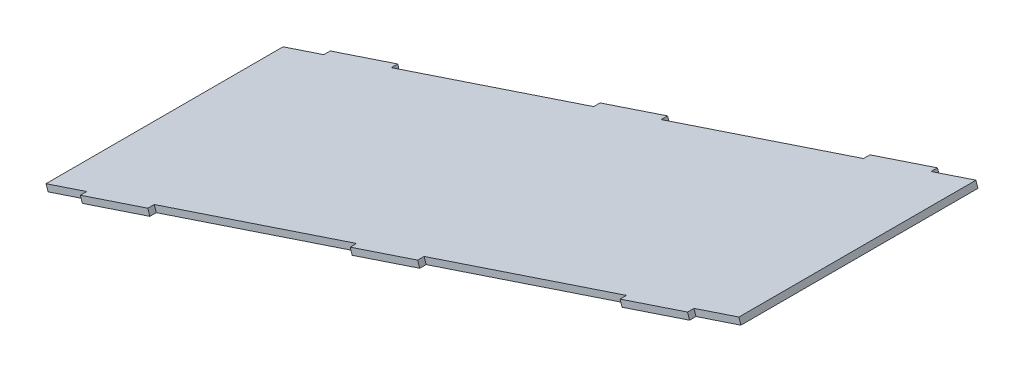
ISO-10303-21;
HEADER;
FILE_DESCRIPTION(('STEP AP214'),'2;1');
FILE_NAME('part.step','',(''),(''),'','','');
FILE_SCHEMA(('AUTOMOTIVE_DESIGN { 1 0 10303 214 1 1 1 1 }'));
ENDSEC;
DATA;
#1=APPLICATION_CONTEXT('core data for automotive mechanical design processes');
#2=APPLICATION_PROTOCOL_DEFINITION('international standard','automotive_design',2000,#1);
#3=PRODUCT_CONTEXT('',#1,'mechanical');
#4=PRODUCT('Part','Part','',(#3));
#5=PRODUCT_RELATED_PRODUCT_CATEGORY('part','',(#4));
#6=PRODUCT_DEFINITION_FORMATION('','',#4);
#7=PRODUCT_DEFINITION_CONTEXT('part definition',#1,'design');
#8=PRODUCT_DEFINITION('design','',#6,#7);
#9=PRODUCT_DEFINITION_SHAPE('','',#8);
#10=(LENGTH_UNIT() NAMED_UNIT(*) SI_UNIT(.MILLI.,.METRE.));
#11=(NAMED_UNIT(*) PLANE_ANGLE_UNIT() SI_UNIT($,.RADIAN.));
#12=(NAMED_UNIT(*) SI_UNIT($,.STERADIAN.) SOLID_ANGLE_UNIT());
#13=UNCERTAINTY_MEASURE_WITH_UNIT(LENGTH_MEASURE(1.E-05),#10,'distance_accuracy_value','');
#14=(GEOMETRIC_REPRESENTATION_CONTEXT(3) GLOBAL_UNCERTAINTY_ASSIGNED_CONTEXT((#13)) GLOBAL_UNIT_ASSIGNED_CONTEXT((#10,
#11,#12)) REPRESENTATION_CONTEXT('',''));
#15=CARTESIAN_POINT('',(0.,0.,0.));
#16=DIRECTION('',(0.,0.,1.));
#17=DIRECTION('',(1.,0.,0.));
#18=AXIS2_PLACEMENT_3D('',#15,#16,#17);
#19=CARTESIAN_POINT('',(0.,0.,100.));
#20=DIRECTION('',(0.,0.,-1.));
#21=DIRECTION('',(1.,0.,0.));
#22=AXIS2_PLACEMENT_3D('',#19,#20,#21);
#23=PLANE('',#22);
#24=DIRECTION('',(-0.948683298050516,-0.316227766016832,0.));
#25=VECTOR('',#24,1.);
#26=CARTESIAN_POINT('',(6.68696438322838E-13,99.999999999998,100.));
#27=LINE('',#26,#25);
#28=CARTESIAN_POINT('',(-275.118156434649,8.29394785511686,100.));
#29=VERTEX_POINT('',#28);
#30=CARTESIAN_POINT('',(-292.31566528579,2.56144490473659,100.));
#31=VERTEX_POINT('',#30);
#32=EDGE_CURVE('E347',#29,#31,#27,.T.);
#33=ORIENTED_EDGE('',*,*,#32,.T.);
#34=DIRECTION('',(0.316227766016844,-0.948683298050512,0.));
#35=VECTOR('',#34,1.);
#36=CARTESIAN_POINT('',(-262.315665285789,-87.4385550952649,100.));
#37=LINE('',#36,#35);
#38=CARTESIAN_POINT('',(-291.461850317545,0.,100.));
#39=VERTEX_POINT('',#38);
#40=EDGE_CURVE('E221',#31,#39,#37,.T.);
#41=ORIENTED_EDGE('',*,*,#40,.T.);
#42=DIRECTION('',(0.948683298050516,0.316227766016832,0.));
#43=VECTOR('',#42,1.);
#44=CARTESIAN_POINT('',(-299.146185031754,-2.5614449047366,100.));
#45=LINE('',#44,#43);
#46=CARTESIAN_POINT('',(-274.264341466403,5.73250295038025,100.));
#47=VERTEX_POINT('',#46);
#48=EDGE_CURVE('E334',#39,#47,#45,.T.);
#49=ORIENTED_EDGE('',*,*,#48,.T.);
#50=DIRECTION('',(-0.316227766016832,0.948683298050516,0.));
#51=VECTOR('',#50,1.);
#52=CARTESIAN_POINT('',(-264.739164302697,-22.84302854074,99.9999999999983));
#53=LINE('',#52,#51);
#54=EDGE_CURVE('E57',#47,#29,#53,.T.);
#55=ORIENTED_EDGE('',*,*,#54,.T.);
#56=EDGE_LOOP('',(#33,#41,#49,#55));
#57=FACE_BOUND('',#56,.T.);
#58=ADVANCED_FACE('F34',(#57),#23,.F.);
#59=DIRECTION('',(-0.316227766016832,0.948683298050516,0.));
#60=VECTOR('',#59,1.);
#61=CARTESIAN_POINT('',(-236.278665361181,-13.356195560235,99.9999999999983));
#62=LINE('',#61,#60);
#63=CARTESIAN_POINT('',(-245.803842524888,15.2193359308852,99.9999999999983));
#64=VERTEX_POINT('',#63);
#65=CARTESIAN_POINT('',(-246.657657493133,17.7807808356218,100.));
#66=VERTEX_POINT('',#65);
#67=EDGE_CURVE('E405',#64,#66,#62,.T.);
#68=ORIENTED_EDGE('',*,*,#67,.F.);
#69=CARTESIAN_POINT('',(-160.422345700342,43.6798348724001,100.));
#70=VERTEX_POINT('',#69);
#71=EDGE_CURVE('E338',#64,#70,#45,.T.);
#72=ORIENTED_EDGE('',*,*,#71,.T.);
#73=DIRECTION('',(-0.316227766016832,0.948683298050516,0.));
#74=VECTOR('',#73,1.);
#75=CARTESIAN_POINT('',(-150.897168536635,15.1043033812798,99.9999999999992));
#76=LINE('',#75,#74);
#77=CARTESIAN_POINT('',(-161.276160668587,46.2412797771366,100.));
#78=VERTEX_POINT('',#77);
#79=EDGE_CURVE('E379',#70,#78,#76,.T.);
#80=ORIENTED_EDGE('',*,*,#79,.T.);
#81=EDGE_CURVE('E433',#78,#66,#27,.T.);
#82=ORIENTED_EDGE('',*,*,#81,.T.);
#83=EDGE_LOOP('',(#68,#72,#80,#82));
#84=FACE_BOUND('',#83,.T.);
#85=ADVANCED_FACE('F490',(#84),#23,.F.);
#86=DIRECTION('',(-0.316227766016832,0.948683298050516,0.));
#87=VECTOR('',#86,1.);
#88=CARTESIAN_POINT('',(-122.436669595119,24.5911363617848,99.9999999999992));
#89=LINE('',#88,#87);
#90=CARTESIAN_POINT('',(-131.961846758826,53.1666678529051,99.9999999999992));
#91=VERTEX_POINT('',#90);
#92=CARTESIAN_POINT('',(-132.815661727072,55.7281127576416,100.));
#93=VERTEX_POINT('',#92);
#94=EDGE_CURVE('E378',#91,#93,#89,.T.);
#95=ORIENTED_EDGE('',*,*,#94,.F.);
#96=CARTESIAN_POINT('',(-46.5803499342797,81.62716679442,100.));
#97=VERTEX_POINT('',#96);
#98=EDGE_CURVE('E455',#91,#97,#45,.T.);
#99=ORIENTED_EDGE('',*,*,#98,.T.);
#100=DIRECTION('',(-0.316227766016832,0.948683298050516,0.));
#101=VECTOR('',#100,1.);
#102=CARTESIAN_POINT('',(-37.0551727705731,53.0516353032997,100.));
#103=LINE('',#102,#101);
#104=CARTESIAN_POINT('',(-47.4341649025251,84.1886116991564,100.));
#105=VERTEX_POINT('',#104);
#106=EDGE_CURVE('E353',#97,#105,#103,.T.);
#107=ORIENTED_EDGE('',*,*,#106,.T.);
#108=EDGE_CURVE('E346',#105,#93,#27,.T.);
#109=ORIENTED_EDGE('',*,*,#108,.T.);
#110=EDGE_LOOP('',(#95,#99,#107,#109));
#111=FACE_BOUND('',#110,.T.);
#112=ADVANCED_FACE('F440',(#111),#23,.F.);
#113=DIRECTION('',(-0.316227766016832,0.948683298050516,0.));
#114=VECTOR('',#113,1.);
#115=CARTESIAN_POINT('',(-8.59467382905762,62.5384682838046,100.));
#116=LINE('',#115,#114);
#117=CARTESIAN_POINT('',(-18.1198509927642,91.113999774925,100.));
#118=VERTEX_POINT('',#117);
#119=CARTESIAN_POINT('',(-18.9736659610097,93.6754446796614,100.));
#120=VERTEX_POINT('',#119);
#121=EDGE_CURVE('E352',#118,#120,#116,.T.);
#122=ORIENTED_EDGE('',*,*,#121,.F.);
#123=CARTESIAN_POINT('',(0.853814968246116,97.4385550952616,100.));
#124=VERTEX_POINT('',#123);
#125=EDGE_CURVE('E339',#118,#124,#45,.T.);
#126=ORIENTED_EDGE('',*,*,#125,.T.);
#127=DIRECTION('',(-0.316227766016832,0.948683298050516,0.));
#128=VECTOR('',#127,1.);
#129=CARTESIAN_POINT('',(0.853814968246116,97.4385550952616,100.));
#130=LINE('',#129,#128);
#131=CARTESIAN_POINT('',(6.68696438322838E-13,99.999999999998,100.));
#132=VERTEX_POINT('',#131);
#133=EDGE_CURVE('E340',#124,#132,#130,.T.);
#134=ORIENTED_EDGE('',*,*,#133,.T.);
#135=EDGE_CURVE('E343',#132,#120,#27,.T.);
#136=ORIENTED_EDGE('',*,*,#135,.T.);
#137=EDGE_LOOP('',(#122,#126,#134,#136));
#138=FACE_BOUND('',#137,.T.);
#139=ADVANCED_FACE('F460',(#138),#23,.F.);
#140=CARTESIAN_POINT('',(0.,0.,0.));
#141=DIRECTION('',(0.,0.,1.));
#142=DIRECTION('',(1.,0.,0.));
#143=AXIS2_PLACEMENT_3D('',#140,#141,#142);
#144=PLANE('',#143);
#145=DIRECTION('',(0.948683298050516,0.316227766016832,0.));
#146=VECTOR('',#145,1.);
#147=CARTESIAN_POINT('',(-299.146185031754,-2.5614449047366,0.));
#148=LINE('',#147,#146);
#149=CARTESIAN_POINT('',(-291.461850317545,0.,0.));
#150=VERTEX_POINT('',#149);
#151=CARTESIAN_POINT('',(-274.264341466403,5.73250295038026,1.6757428777936E-12));
#152=VERTEX_POINT('',#151);
#153=EDGE_CURVE('E232',#150,#152,#148,.T.);
#154=ORIENTED_EDGE('',*,*,#153,.F.);
#155=DIRECTION('',(0.316227766016844,-0.948683298050512,0.));
#156=VECTOR('',#155,1.);
#157=CARTESIAN_POINT('',(-291.461850317545,0.,0.));
#158=LINE('',#157,#156);
#159=CARTESIAN_POINT('',(-292.31566528579,2.56144490473659,0.));
#160=VERTEX_POINT('',#159);
#161=EDGE_CURVE('E49',#160,#150,#158,.T.);
#162=ORIENTED_EDGE('',*,*,#161,.F.);
#163=DIRECTION('',(-0.948683298050516,-0.316227766016832,0.));
#164=VECTOR('',#163,1.);
#165=CARTESIAN_POINT('',(6.68696438322838E-13,99.999999999998,0.));
#166=LINE('',#165,#164);
#167=CARTESIAN_POINT('',(-275.118156434649,8.29394785511686,1.6759110426447E-12));
#168=VERTEX_POINT('',#167);
#169=EDGE_CURVE('E231',#168,#160,#166,.T.);
#170=ORIENTED_EDGE('',*,*,#169,.F.);
#171=DIRECTION('',(-0.316227766016832,0.948683298050516,0.));
#172=VECTOR('',#171,1.);
#173=CARTESIAN_POINT('',(-264.739164302697,-22.84302854074,1.6759110426447E-12));
#174=LINE('',#173,#172);
#175=EDGE_CURVE('E325',#152,#168,#174,.T.);
#176=ORIENTED_EDGE('',*,*,#175,.F.);
#177=EDGE_LOOP('',(#154,#162,#170,#176));
#178=FACE_BOUND('',#177,.T.);
#179=ADVANCED_FACE('F229',(#178),#144,.F.);
#180=CARTESIAN_POINT('',(-245.803842524888,15.2193359308852,0.));
#181=VERTEX_POINT('',#180);
#182=CARTESIAN_POINT('',(-160.422345700342,43.6798348724001,8.37871438896798E-13));
#183=VERTEX_POINT('',#182);
#184=EDGE_CURVE('E776',#181,#183,#148,.T.);
#185=ORIENTED_EDGE('',*,*,#184,.F.);
#186=DIRECTION('',(-0.316227766016832,0.948683298050516,0.));
#187=VECTOR('',#186,1.);
#188=CARTESIAN_POINT('',(-236.278665361181,-13.356195560235,1.6759110426447E-12));
#189=LINE('',#188,#187);
#190=CARTESIAN_POINT('',(-246.657657493133,17.7807808356218,1.6759110426447E-12));
#191=VERTEX_POINT('',#190);
#192=EDGE_CURVE('E318',#181,#191,#189,.T.);
#193=ORIENTED_EDGE('',*,*,#192,.T.);
#194=CARTESIAN_POINT('',(-161.276160668587,46.2412797771367,8.37955521322352E-13));
#195=VERTEX_POINT('',#194);
#196=EDGE_CURVE('E238',#195,#191,#166,.T.);
#197=ORIENTED_EDGE('',*,*,#196,.F.);
#198=DIRECTION('',(-0.316227766016832,0.948683298050516,0.));
#199=VECTOR('',#198,1.);
#200=CARTESIAN_POINT('',(-150.897168536635,15.1043033812798,8.37955521322352E-13));
#201=LINE('',#200,#199);
#202=EDGE_CURVE('E304',#183,#195,#201,.T.);
#203=ORIENTED_EDGE('',*,*,#202,.F.);
#204=EDGE_LOOP('',(#185,#193,#197,#203));
#205=FACE_BOUND('',#204,.T.);
#206=ADVANCED_FACE('F500',(#205),#144,.F.);
#207=CARTESIAN_POINT('',(-131.961846758826,53.1666678529051,0.));
#208=VERTEX_POINT('',#207);
#209=CARTESIAN_POINT('',(-46.5803499342796,81.62716679442,0.));
#210=VERTEX_POINT('',#209);
#211=EDGE_CURVE('E254',#208,#210,#148,.T.);
#212=ORIENTED_EDGE('',*,*,#211,.F.);
#213=DIRECTION('',(-0.316227766016832,0.948683298050516,0.));
#214=VECTOR('',#213,1.);
#215=CARTESIAN_POINT('',(-122.436669595119,24.5911363617848,8.37955521322352E-13));
#216=LINE('',#215,#214);
#217=CARTESIAN_POINT('',(-132.815661727072,55.7281127576416,8.37955521322352E-13));
#218=VERTEX_POINT('',#217);
#219=EDGE_CURVE('E271',#208,#218,#216,.T.);
#220=ORIENTED_EDGE('',*,*,#219,.T.);
#221=CARTESIAN_POINT('',(-47.4341649025251,84.1886116991565,0.));
#222=VERTEX_POINT('',#221);
#223=EDGE_CURVE('E243',#222,#218,#166,.T.);
#224=ORIENTED_EDGE('',*,*,#223,.F.);
#225=DIRECTION('',(-0.316227766016832,0.948683298050516,0.));
#226=VECTOR('',#225,1.);
#227=CARTESIAN_POINT('',(-37.0551727705731,53.0516353032997,0.));
#228=LINE('',#227,#226);
#229=EDGE_CURVE('E269',#210,#222,#228,.T.);
#230=ORIENTED_EDGE('',*,*,#229,.F.);
#231=EDGE_LOOP('',(#212,#220,#224,#230));
#232=FACE_BOUND('',#231,.T.);
#233=ADVANCED_FACE('F268',(#232),#144,.F.);
#234=CARTESIAN_POINT('',(6.68696438322838E-13,99.999999999998,50.));
#235=DIRECTION('',(0.316227766016832,-0.948683298050516,0.));
#236=DIRECTION('',(0.948683298050516,0.316227766016832,0.));
#237=AXIS2_PLACEMENT_3D('',#234,#235,#236);
#238=PLANE('',#237);
#239=ORIENTED_EDGE('',*,*,#169,.T.);
#240=DIRECTION('',(0.,0.,-1.));
#241=VECTOR('',#240,1.);
#242=CARTESIAN_POINT('',(-292.31566528579,2.56144490473659,102.7));
#243=LINE('',#242,#241);
#244=EDGE_CURVE('E218',#31,#160,#243,.T.);
#245=ORIENTED_EDGE('',*,*,#244,.F.);
#246=ORIENTED_EDGE('',*,*,#32,.F.);
#247=DIRECTION('',(0.,0.,-1.));
#248=VECTOR('',#247,1.);
#249=CARTESIAN_POINT('',(-275.118156434649,8.29394785511686,102.699999999998));
#250=LINE('',#249,#248);
#251=CARTESIAN_POINT('',(-275.118156434649,8.29394785511686,102.699999999998));
#252=VERTEX_POINT('',#251);
#253=EDGE_CURVE('E419',#252,#29,#250,.T.);
#254=ORIENTED_EDGE('',*,*,#253,.F.);
#255=DIRECTION('',(-0.948683298050516,-0.316227766016832,0.));
#256=VECTOR('',#255,1.);
#257=CARTESIAN_POINT('',(-246.657657493133,17.7807808356218,102.699999999998));
#258=LINE('',#257,#256);
#259=CARTESIAN_POINT('',(-246.657657493133,17.7807808356218,102.699999999998));
#260=VERTEX_POINT('',#259);
#261=EDGE_CURVE('E416',#260,#252,#258,.T.);
#262=ORIENTED_EDGE('',*,*,#261,.F.);
#263=DIRECTION('',(0.,0.,1.));
#264=VECTOR('',#263,1.);
#265=CARTESIAN_POINT('',(-246.657657493133,17.7807808356218,99.9999999999983));
#266=LINE('',#265,#264);
#267=EDGE_CURVE('E408',#66,#260,#266,.T.);
#268=ORIENTED_EDGE('',*,*,#267,.F.);
#269=ORIENTED_EDGE('',*,*,#81,.F.);
#270=DIRECTION('',(0.,0.,-1.));
#271=VECTOR('',#270,1.);
#272=CARTESIAN_POINT('',(-161.276160668587,46.2412797771367,102.699999999999));
#273=LINE('',#272,#271);
#274=CARTESIAN_POINT('',(-161.276160668587,46.2412797771367,102.699999999999));
#275=VERTEX_POINT('',#274);
#276=EDGE_CURVE('E393',#275,#78,#273,.T.);
#277=ORIENTED_EDGE('',*,*,#276,.F.);
#278=DIRECTION('',(-0.948683298050516,-0.316227766016832,0.));
#279=VECTOR('',#278,1.);
#280=CARTESIAN_POINT('',(-132.815661727072,55.7281127576416,102.699999999999));
#281=LINE('',#280,#279);
#282=CARTESIAN_POINT('',(-132.815661727072,55.7281127576416,102.699999999999));
#283=VERTEX_POINT('',#282);
#284=EDGE_CURVE('E390',#283,#275,#281,.T.);
#285=ORIENTED_EDGE('',*,*,#284,.F.);
#286=DIRECTION('',(0.,0.,1.));
#287=VECTOR('',#286,1.);
#288=CARTESIAN_POINT('',(-132.815661727072,55.7281127576416,99.9999999999992));
#289=LINE('',#288,#287);
#290=EDGE_CURVE('E382',#93,#283,#289,.T.);
#291=ORIENTED_EDGE('',*,*,#290,.F.);
#292=ORIENTED_EDGE('',*,*,#108,.F.);
#293=DIRECTION('',(0.,0.,-1.));
#294=VECTOR('',#293,1.);
#295=CARTESIAN_POINT('',(-47.4341649025251,84.1886116991565,102.7));
#296=LINE('',#295,#294);
#297=CARTESIAN_POINT('',(-47.4341649025251,84.1886116991565,102.7));
#298=VERTEX_POINT('',#297);
#299=EDGE_CURVE('E367',#298,#105,#296,.T.);
#300=ORIENTED_EDGE('',*,*,#299,.F.);
#301=DIRECTION('',(-0.948683298050516,-0.316227766016832,0.));
#302=VECTOR('',#301,1.);
#303=CARTESIAN_POINT('',(-18.9736659610097,93.6754446796614,102.7));
#304=LINE('',#303,#302);
#305=CARTESIAN_POINT('',(-18.9736659610097,93.6754446796614,102.7));
#306=VERTEX_POINT('',#305);
#307=EDGE_CURVE('E364',#306,#298,#304,.T.);
#308=ORIENTED_EDGE('',*,*,#307,.F.);
#309=DIRECTION('',(0.,0.,1.));
#310=VECTOR('',#309,1.);
#311=CARTESIAN_POINT('',(-18.9736659610097,93.6754446796614,100.));
#312=LINE('',#311,#310);
#313=EDGE_CURVE('E357',#120,#306,#312,.T.);
#314=ORIENTED_EDGE('',*,*,#313,.F.);
#315=ORIENTED_EDGE('',*,*,#135,.F.);
#316=DIRECTION('',(0.,0.,-1.));
#317=VECTOR('',#316,1.);
#318=CARTESIAN_POINT('',(6.68696438322838E-13,99.999999999998,50.));
#319=LINE('',#318,#317);
#320=CARTESIAN_POINT('',(6.68696438322838E-13,99.999999999998,0.));
#321=VERTEX_POINT('',#320);
#322=EDGE_CURVE('E42',#132,#321,#319,.T.);
#323=ORIENTED_EDGE('',*,*,#322,.T.);
#324=CARTESIAN_POINT('',(-18.9736659610097,93.6754446796614,0.));
#325=VERTEX_POINT('',#324);
#326=EDGE_CURVE('E241',#321,#325,#166,.T.);
#327=ORIENTED_EDGE('',*,*,#326,.T.);
#328=DIRECTION('',(0.,0.,-1.));
#329=VECTOR('',#328,1.);
#330=CARTESIAN_POINT('',(-18.9736659610097,93.6754446796614,0.));
#331=LINE('',#330,#329);
#332=CARTESIAN_POINT('',(-18.9736659610097,93.6754446796614,-2.7));
#333=VERTEX_POINT('',#332);
#334=EDGE_CURVE('E289',#325,#333,#331,.T.);
#335=ORIENTED_EDGE('',*,*,#334,.T.);
#336=DIRECTION('',(-0.948683298050516,-0.316227766016832,0.));
#337=VECTOR('',#336,1.);
#338=CARTESIAN_POINT('',(-18.9736659610097,93.6754446796614,-2.7));
#339=LINE('',#338,#337);
#340=CARTESIAN_POINT('',(-47.4341649025251,84.1886116991565,-2.7));
#341=VERTEX_POINT('',#340);
#342=EDGE_CURVE('E288',#333,#341,#339,.T.);
#343=ORIENTED_EDGE('',*,*,#342,.T.);
#344=DIRECTION('',(0.,0.,1.));
#345=VECTOR('',#344,1.);
#346=CARTESIAN_POINT('',(-47.4341649025251,84.1886116991565,-2.7));
#347=LINE('',#346,#345);
#348=EDGE_CURVE('E262',#341,#222,#347,.T.);
#349=ORIENTED_EDGE('',*,*,#348,.T.);
#350=ORIENTED_EDGE('',*,*,#223,.T.);
#351=DIRECTION('',(0.,0.,-1.));
#352=VECTOR('',#351,1.);
#353=CARTESIAN_POINT('',(-132.815661727072,55.7281127576416,8.37955521322352E-13));
#354=LINE('',#353,#352);
#355=CARTESIAN_POINT('',(-132.815661727072,55.7281127576416,-2.69999999999916));
#356=VERTEX_POINT('',#355);
#357=EDGE_CURVE('E259',#218,#356,#354,.T.);
#358=ORIENTED_EDGE('',*,*,#357,.T.);
#359=DIRECTION('',(-0.948683298050516,-0.316227766016832,0.));
#360=VECTOR('',#359,1.);
#361=CARTESIAN_POINT('',(-132.815661727072,55.7281127576416,-2.69999999999916));
#362=LINE('',#361,#360);
#363=CARTESIAN_POINT('',(-161.276160668587,46.2412797771367,-2.69999999999916));
#364=VERTEX_POINT('',#363);
#365=EDGE_CURVE('E309',#356,#364,#362,.T.);
#366=ORIENTED_EDGE('',*,*,#365,.T.);
#367=DIRECTION('',(0.,0.,1.));
#368=VECTOR('',#367,1.);
#369=CARTESIAN_POINT('',(-161.276160668587,46.2412797771367,-2.69999999999916));
#370=LINE('',#369,#368);
#371=EDGE_CURVE('E300',#364,#195,#370,.T.);
#372=ORIENTED_EDGE('',*,*,#371,.T.);
#373=ORIENTED_EDGE('',*,*,#196,.T.);
#374=DIRECTION('',(0.,0.,-1.));
#375=VECTOR('',#374,1.);
#376=CARTESIAN_POINT('',(-246.657657493133,17.7807808356218,1.6759110426447E-12));
#377=LINE('',#376,#375);
#378=CARTESIAN_POINT('',(-246.657657493133,17.7807808356218,-2.69999999999832));
#379=VERTEX_POINT('',#378);
#380=EDGE_CURVE('E331',#191,#379,#377,.T.);
#381=ORIENTED_EDGE('',*,*,#380,.T.);
#382=DIRECTION('',(-0.948683298050516,-0.316227766016832,0.));
#383=VECTOR('',#382,1.);
#384=CARTESIAN_POINT('',(-246.657657493133,17.7807808356218,-2.69999999999832));
#385=LINE('',#384,#383);
#386=CARTESIAN_POINT('',(-275.118156434649,8.29394785511686,-2.69999999999832));
#387=VERTEX_POINT('',#386);
#388=EDGE_CURVE('E329',#379,#387,#385,.T.);
#389=ORIENTED_EDGE('',*,*,#388,.T.);
#390=DIRECTION('',(0.,0.,1.));
#391=VECTOR('',#390,1.);
#392=CARTESIAN_POINT('',(-275.118156434649,8.29394785511686,-2.69999999999832));
#393=LINE('',#392,#391);
#394=EDGE_CURVE('E237',#387,#168,#393,.T.);
#395=ORIENTED_EDGE('',*,*,#394,.T.);
#396=EDGE_LOOP('',(#239,#245,#246,#254,#262,#268,#269,#277,#285,#291,#292,#300,#308,#314,#315,
#323,#327,#335,#343,#349,#350,#358,#366,#372,#373,#381,#389,#395));
#397=FACE_BOUND('',#396,.T.);
#398=ADVANCED_FACE('F36',(#397),#238,.F.);
#399=CARTESIAN_POINT('',(-299.146185031754,-2.5614449047366,50.));
#400=DIRECTION('',(-0.316227766016832,0.948683298050516,0.));
#401=DIRECTION('',(-0.948683298050516,-0.316227766016832,0.));
#402=AXIS2_PLACEMENT_3D('',#399,#400,#401);
#403=PLANE('',#402);
#404=ORIENTED_EDGE('',*,*,#48,.F.);
#405=DIRECTION('',(0.,0.,-1.));
#406=VECTOR('',#405,1.);
#407=CARTESIAN_POINT('',(-291.461850317545,0.,102.7));
#408=LINE('',#407,#406);
#409=EDGE_CURVE('E224',#39,#150,#408,.T.);
#410=ORIENTED_EDGE('',*,*,#409,.T.);
#411=ORIENTED_EDGE('',*,*,#153,.T.);
#412=DIRECTION('',(0.,0.,-1.));
#413=VECTOR('',#412,1.);
#414=CARTESIAN_POINT('',(-274.264341466403,5.73250295038026,-2.69999999999832));
#415=LINE('',#414,#413);
#416=CARTESIAN_POINT('',(-274.264341466403,5.73250295038026,-2.69999999999832));
#417=VERTEX_POINT('',#416);
#418=EDGE_CURVE('E317',#152,#417,#415,.T.);
#419=ORIENTED_EDGE('',*,*,#418,.T.);
#420=DIRECTION('',(0.948683298050516,0.316227766016832,0.));
#421=VECTOR('',#420,1.);
#422=CARTESIAN_POINT('',(-245.803842524888,15.2193359308852,-2.69999999999832));
#423=LINE('',#422,#421);
#424=CARTESIAN_POINT('',(-245.803842524888,15.2193359308852,-2.69999999999832));
#425=VERTEX_POINT('',#424);
#426=EDGE_CURVE('E327',#417,#425,#423,.T.);
#427=ORIENTED_EDGE('',*,*,#426,.T.);
#428=DIRECTION('',(0.,0.,1.));
#429=VECTOR('',#428,1.);
#430=CARTESIAN_POINT('',(-245.803842524888,15.2193359308852,1.6759110426447E-12));
#431=LINE('',#430,#429);
#432=EDGE_CURVE('E312',#425,#181,#431,.T.);
#433=ORIENTED_EDGE('',*,*,#432,.T.);
#434=ORIENTED_EDGE('',*,*,#184,.T.);
#435=DIRECTION('',(0.,0.,-1.));
#436=VECTOR('',#435,1.);
#437=CARTESIAN_POINT('',(-160.422345700342,43.6798348724001,-2.69999999999916));
#438=LINE('',#437,#436);
#439=CARTESIAN_POINT('',(-160.422345700342,43.6798348724001,-2.69999999999916));
#440=VERTEX_POINT('',#439);
#441=EDGE_CURVE('E297',#183,#440,#438,.T.);
#442=ORIENTED_EDGE('',*,*,#441,.T.);
#443=DIRECTION('',(0.948683298050516,0.316227766016832,0.));
#444=VECTOR('',#443,1.);
#445=CARTESIAN_POINT('',(-131.961846758826,53.1666678529051,-2.69999999999916));
#446=LINE('',#445,#444);
#447=CARTESIAN_POINT('',(-131.961846758826,53.1666678529051,-2.69999999999916));
#448=VERTEX_POINT('',#447);
#449=EDGE_CURVE('E306',#440,#448,#446,.T.);
#450=ORIENTED_EDGE('',*,*,#449,.T.);
#451=DIRECTION('',(0.,0.,1.));
#452=VECTOR('',#451,1.);
#453=CARTESIAN_POINT('',(-131.961846758826,53.1666678529051,8.37955521322352E-13));
#454=LINE('',#453,#452);
#455=EDGE_CURVE('E291',#448,#208,#454,.T.);
#456=ORIENTED_EDGE('',*,*,#455,.T.);
#457=ORIENTED_EDGE('',*,*,#211,.T.);
#458=DIRECTION('',(0.,0.,-1.));
#459=VECTOR('',#458,1.);
#460=CARTESIAN_POINT('',(-46.5803499342797,81.62716679442,-2.7));
#461=LINE('',#460,#459);
#462=CARTESIAN_POINT('',(-46.5803499342797,81.62716679442,-2.7));
#463=VERTEX_POINT('',#462);
#464=EDGE_CURVE('E245',#210,#463,#461,.T.);
#465=ORIENTED_EDGE('',*,*,#464,.T.);
#466=DIRECTION('',(0.948683298050516,0.316227766016832,0.));
#467=VECTOR('',#466,1.);
#468=CARTESIAN_POINT('',(-18.1198509927642,91.113999774925,-2.7));
#469=LINE('',#468,#467);
#470=CARTESIAN_POINT('',(-18.1198509927642,91.113999774925,-2.7));
#471=VERTEX_POINT('',#470);
#472=EDGE_CURVE('E275',#463,#471,#469,.T.);
#473=ORIENTED_EDGE('',*,*,#472,.T.);
#474=DIRECTION('',(0.,0.,1.));
#475=VECTOR('',#474,1.);
#476=CARTESIAN_POINT('',(-18.1198509927642,91.113999774925,0.));
#477=LINE('',#476,#475);
#478=CARTESIAN_POINT('',(-18.1198509927642,91.113999774925,0.));
#479=VERTEX_POINT('',#478);
#480=EDGE_CURVE('E239',#471,#479,#477,.T.);
#481=ORIENTED_EDGE('',*,*,#480,.T.);
#482=CARTESIAN_POINT('',(0.853814968246116,97.4385550952616,0.));
#483=VERTEX_POINT('',#482);
#484=EDGE_CURVE('E249',#479,#483,#148,.T.);
#485=ORIENTED_EDGE('',*,*,#484,.T.);
#486=DIRECTION('',(0.,0.,-1.));
#487=VECTOR('',#486,1.);
#488=CARTESIAN_POINT('',(0.853814968246116,97.4385550952616,50.));
#489=LINE('',#488,#487);
#490=EDGE_CURVE('E11',#124,#483,#489,.T.);
#491=ORIENTED_EDGE('',*,*,#490,.F.);
#492=ORIENTED_EDGE('',*,*,#125,.F.);
#493=DIRECTION('',(0.,0.,-1.));
#494=VECTOR('',#493,1.);
#495=CARTESIAN_POINT('',(-18.1198509927642,91.113999774925,100.));
#496=LINE('',#495,#494);
#497=CARTESIAN_POINT('',(-18.1198509927642,91.113999774925,102.7));
#498=VERTEX_POINT('',#497);
#499=EDGE_CURVE('E370',#498,#118,#496,.T.);
#500=ORIENTED_EDGE('',*,*,#499,.F.);
#501=DIRECTION('',(0.948683298050516,0.316227766016832,0.));
#502=VECTOR('',#501,1.);
#503=CARTESIAN_POINT('',(-18.1198509927642,91.113999774925,102.7));
#504=LINE('',#503,#502);
#505=CARTESIAN_POINT('',(-46.5803499342797,81.62716679442,102.7));
#506=VERTEX_POINT('',#505);
#507=EDGE_CURVE('E351',#506,#498,#504,.T.);
#508=ORIENTED_EDGE('',*,*,#507,.F.);
#509=DIRECTION('',(0.,0.,1.));
#510=VECTOR('',#509,1.);
#511=CARTESIAN_POINT('',(-46.5803499342797,81.62716679442,102.7));
#512=LINE('',#511,#510);
#513=EDGE_CURVE('E348',#97,#506,#512,.T.);
#514=ORIENTED_EDGE('',*,*,#513,.F.);
#515=ORIENTED_EDGE('',*,*,#98,.F.);
#516=DIRECTION('',(0.,0.,-1.));
#517=VECTOR('',#516,1.);
#518=CARTESIAN_POINT('',(-131.961846758826,53.1666678529051,99.9999999999992));
#519=LINE('',#518,#517);
#520=CARTESIAN_POINT('',(-131.961846758826,53.1666678529051,102.699999999999));
#521=VERTEX_POINT('',#520);
#522=EDGE_CURVE('E369',#521,#91,#519,.T.);
#523=ORIENTED_EDGE('',*,*,#522,.F.);
#524=DIRECTION('',(0.948683298050516,0.316227766016832,0.));
#525=VECTOR('',#524,1.);
#526=CARTESIAN_POINT('',(-131.961846758826,53.1666678529051,102.699999999999));
#527=LINE('',#526,#525);
#528=CARTESIAN_POINT('',(-160.422345700342,43.6798348724001,102.699999999999));
#529=VERTEX_POINT('',#528);
#530=EDGE_CURVE('E377',#529,#521,#527,.T.);
#531=ORIENTED_EDGE('',*,*,#530,.F.);
#532=DIRECTION('',(0.,0.,1.));
#533=VECTOR('',#532,1.);
#534=CARTESIAN_POINT('',(-160.422345700342,43.6798348724001,102.699999999999));
#535=LINE('',#534,#533);
#536=EDGE_CURVE('E374',#70,#529,#535,.T.);
#537=ORIENTED_EDGE('',*,*,#536,.F.);
#538=ORIENTED_EDGE('',*,*,#71,.F.);
#539=DIRECTION('',(0.,0.,-1.));
#540=VECTOR('',#539,1.);
#541=CARTESIAN_POINT('',(-245.803842524888,15.2193359308852,99.9999999999983));
#542=LINE('',#541,#540);
#543=CARTESIAN_POINT('',(-245.803842524888,15.2193359308852,102.699999999998));
#544=VERTEX_POINT('',#543);
#545=EDGE_CURVE('E396',#544,#64,#542,.T.);
#546=ORIENTED_EDGE('',*,*,#545,.F.);
#547=DIRECTION('',(0.948683298050516,0.316227766016832,0.));
#548=VECTOR('',#547,1.);
#549=CARTESIAN_POINT('',(-245.803842524888,15.2193359308852,102.699999999998));
#550=LINE('',#549,#548);
#551=CARTESIAN_POINT('',(-274.264341466403,5.73250295038026,102.699999999998));
#552=VERTEX_POINT('',#551);
#553=EDGE_CURVE('E404',#552,#544,#550,.T.);
#554=ORIENTED_EDGE('',*,*,#553,.F.);
#555=DIRECTION('',(0.,0.,1.));
#556=VECTOR('',#555,1.);
#557=CARTESIAN_POINT('',(-274.264341466403,5.73250295038026,102.699999999998));
#558=LINE('',#557,#556);
#559=EDGE_CURVE('E401',#47,#552,#558,.T.);
#560=ORIENTED_EDGE('',*,*,#559,.F.);
#561=EDGE_LOOP('',(#404,#410,#411,#419,#427,#433,#434,#442,#450,#456,#457,#465,#473,#481,#485,
#491,#492,#500,#508,#514,#515,#523,#531,#537,#538,#546,#554,#560));
#562=FACE_BOUND('',#561,.T.);
#563=ADVANCED_FACE('F429',(#562),#403,.F.);
#564=CARTESIAN_POINT('',(0.853814968246116,97.4385550952616,50.));
#565=DIRECTION('',(-0.948683298050516,-0.316227766016832,0.));
#566=DIRECTION('',(0.316227766016832,-0.948683298050516,0.));
#567=AXIS2_PLACEMENT_3D('',#564,#565,#566);
#568=PLANE('',#567);
#569=DIRECTION('',(-0.316227766016832,0.948683298050516,0.));
#570=VECTOR('',#569,1.);
#571=CARTESIAN_POINT('',(0.853814968246116,97.4385550952616,0.));
#572=LINE('',#571,#570);
#573=EDGE_CURVE('E466',#483,#321,#572,.T.);
#574=ORIENTED_EDGE('',*,*,#573,.T.);
#575=ORIENTED_EDGE('',*,*,#322,.F.);
#576=ORIENTED_EDGE('',*,*,#133,.F.);
#577=ORIENTED_EDGE('',*,*,#490,.T.);
#578=EDGE_LOOP('',(#574,#575,#576,#577));
#579=FACE_BOUND('',#578,.T.);
#580=ADVANCED_FACE('F464',(#579),#568,.F.);
#581=ORIENTED_EDGE('',*,*,#484,.F.);
#582=DIRECTION('',(-0.316227766016832,0.948683298050516,0.));
#583=VECTOR('',#582,1.);
#584=CARTESIAN_POINT('',(-8.59467382905762,62.5384682838046,0.));
#585=LINE('',#584,#583);
#586=EDGE_CURVE('E285',#479,#325,#585,.T.);
#587=ORIENTED_EDGE('',*,*,#586,.T.);
#588=ORIENTED_EDGE('',*,*,#326,.F.);
#589=ORIENTED_EDGE('',*,*,#573,.F.);
#590=EDGE_LOOP('',(#581,#587,#588,#589));
#591=FACE_BOUND('',#590,.T.);
#592=ADVANCED_FACE('F502',(#591),#144,.F.);
#593=CARTESIAN_POINT('',(-37.0551727705731,53.0516353032997,-2.7));
#594=DIRECTION('',(-0.948683298050516,-0.316227766016832,0.));
#595=DIRECTION('',(0.316227766016832,-0.948683298050516,0.));
#596=AXIS2_PLACEMENT_3D('',#593,#594,#595);
#597=PLANE('',#596);
#598=ORIENTED_EDGE('',*,*,#464,.F.);
#599=ORIENTED_EDGE('',*,*,#229,.T.);
#600=ORIENTED_EDGE('',*,*,#348,.F.);
#601=DIRECTION('',(-0.316227766016832,0.948683298050516,0.));
#602=VECTOR('',#601,1.);
#603=CARTESIAN_POINT('',(-37.0551727705731,53.0516353032997,-2.7));
#604=LINE('',#603,#602);
#605=EDGE_CURVE('E276',#463,#341,#604,.T.);
#606=ORIENTED_EDGE('',*,*,#605,.F.);
#607=EDGE_LOOP('',(#598,#599,#600,#606));
#608=FACE_BOUND('',#607,.T.);
#609=ADVANCED_FACE('F273',(#608),#597,.T.);
#610=CARTESIAN_POINT('',(-8.59467382905762,62.5384682838046,-2.7));
#611=DIRECTION('',(0.,0.,-1.));
#612=DIRECTION('',(-1.,0.,0.));
#613=AXIS2_PLACEMENT_3D('',#610,#611,#612);
#614=PLANE('',#613);
#615=ORIENTED_EDGE('',*,*,#472,.F.);
#616=ORIENTED_EDGE('',*,*,#605,.T.);
#617=ORIENTED_EDGE('',*,*,#342,.F.);
#618=DIRECTION('',(-0.316227766016832,0.948683298050516,0.));
#619=VECTOR('',#618,1.);
#620=CARTESIAN_POINT('',(-8.59467382905762,62.5384682838046,-2.7));
#621=LINE('',#620,#619);
#622=EDGE_CURVE('E279',#471,#333,#621,.T.);
#623=ORIENTED_EDGE('',*,*,#622,.F.);
#624=EDGE_LOOP('',(#615,#616,#617,#623));
#625=FACE_BOUND('',#624,.T.);
#626=ADVANCED_FACE('F588',(#625),#614,.T.);
#627=CARTESIAN_POINT('',(-8.59467382905762,62.5384682838046,0.));
#628=DIRECTION('',(0.948683298050516,0.316227766016832,0.));
#629=DIRECTION('',(-0.316227766016832,0.948683298050516,0.));
#630=AXIS2_PLACEMENT_3D('',#627,#628,#629);
#631=PLANE('',#630);
#632=ORIENTED_EDGE('',*,*,#480,.F.);
#633=ORIENTED_EDGE('',*,*,#622,.T.);
#634=ORIENTED_EDGE('',*,*,#334,.F.);
#635=ORIENTED_EDGE('',*,*,#586,.F.);
#636=EDGE_LOOP('',(#632,#633,#634,#635));
#637=FACE_BOUND('',#636,.T.);
#638=ADVANCED_FACE('F578',(#637),#631,.T.);
#639=CARTESIAN_POINT('',(-150.897168536635,15.1043033812798,-2.69999999999916));
#640=DIRECTION('',(-0.948683298050516,-0.316227766016832,0.));
#641=DIRECTION('',(0.316227766016832,-0.948683298050516,0.));
#642=AXIS2_PLACEMENT_3D('',#639,#640,#641);
#643=PLANE('',#642);
#644=ORIENTED_EDGE('',*,*,#441,.F.);
#645=ORIENTED_EDGE('',*,*,#202,.T.);
#646=ORIENTED_EDGE('',*,*,#371,.F.);
#647=DIRECTION('',(-0.316227766016832,0.948683298050516,0.));
#648=VECTOR('',#647,1.);
#649=CARTESIAN_POINT('',(-150.897168536635,15.1043033812798,-2.69999999999916));
#650=LINE('',#649,#648);
#651=EDGE_CURVE('E302',#440,#364,#650,.T.);
#652=ORIENTED_EDGE('',*,*,#651,.F.);
#653=EDGE_LOOP('',(#644,#645,#646,#652));
#654=FACE_BOUND('',#653,.T.);
#655=ADVANCED_FACE('F568',(#654),#643,.T.);
#656=CARTESIAN_POINT('',(-122.436669595119,24.5911363617848,-2.69999999999916));
#657=DIRECTION('',(0.,0.,-1.));
#658=DIRECTION('',(-1.,0.,0.));
#659=AXIS2_PLACEMENT_3D('',#656,#657,#658);
#660=PLANE('',#659);
#661=ORIENTED_EDGE('',*,*,#449,.F.);
#662=ORIENTED_EDGE('',*,*,#651,.T.);
#663=ORIENTED_EDGE('',*,*,#365,.F.);
#664=DIRECTION('',(-0.316227766016832,0.948683298050516,0.));
#665=VECTOR('',#664,1.);
#666=CARTESIAN_POINT('',(-122.436669595119,24.5911363617848,-2.69999999999916));
#667=LINE('',#666,#665);
#668=EDGE_CURVE('E299',#448,#356,#667,.T.);
#669=ORIENTED_EDGE('',*,*,#668,.F.);
#670=EDGE_LOOP('',(#661,#662,#663,#669));
#671=FACE_BOUND('',#670,.T.);
#672=ADVANCED_FACE('F558',(#671),#660,.T.);
#673=CARTESIAN_POINT('',(-122.436669595119,24.5911363617848,8.37955521322352E-13));
#674=DIRECTION('',(0.948683298050516,0.316227766016832,0.));
#675=DIRECTION('',(-0.316227766016832,0.948683298050516,0.));
#676=AXIS2_PLACEMENT_3D('',#673,#674,#675);
#677=PLANE('',#676);
#678=ORIENTED_EDGE('',*,*,#455,.F.);
#679=ORIENTED_EDGE('',*,*,#668,.T.);
#680=ORIENTED_EDGE('',*,*,#357,.F.);
#681=ORIENTED_EDGE('',*,*,#219,.F.);
#682=EDGE_LOOP('',(#678,#679,#680,#681));
#683=FACE_BOUND('',#682,.T.);
#684=ADVANCED_FACE('F549',(#683),#677,.T.);
#685=CARTESIAN_POINT('',(-264.739164302697,-22.84302854074,-2.69999999999832));
#686=DIRECTION('',(-0.948683298050516,-0.316227766016832,0.));
#687=DIRECTION('',(0.316227766016832,-0.948683298050516,0.));
#688=AXIS2_PLACEMENT_3D('',#685,#686,#687);
#689=PLANE('',#688);
#690=ORIENTED_EDGE('',*,*,#418,.F.);
#691=ORIENTED_EDGE('',*,*,#175,.T.);
#692=ORIENTED_EDGE('',*,*,#394,.F.);
#693=DIRECTION('',(-0.316227766016832,0.948683298050516,0.));
#694=VECTOR('',#693,1.);
#695=CARTESIAN_POINT('',(-264.739164302697,-22.84302854074,-2.69999999999832));
#696=LINE('',#695,#694);
#697=EDGE_CURVE('E323',#417,#387,#696,.T.);
#698=ORIENTED_EDGE('',*,*,#697,.F.);
#699=EDGE_LOOP('',(#690,#691,#692,#698));
#700=FACE_BOUND('',#699,.T.);
#701=ADVANCED_FACE('F539',(#700),#689,.T.);
#702=CARTESIAN_POINT('',(-236.278665361181,-13.356195560235,-2.69999999999832));
#703=DIRECTION('',(0.,0.,-1.));
#704=DIRECTION('',(-1.,0.,0.));
#705=AXIS2_PLACEMENT_3D('',#702,#703,#704);
#706=PLANE('',#705);
#707=ORIENTED_EDGE('',*,*,#426,.F.);
#708=ORIENTED_EDGE('',*,*,#697,.T.);
#709=ORIENTED_EDGE('',*,*,#388,.F.);
#710=DIRECTION('',(-0.316227766016832,0.948683298050516,0.));
#711=VECTOR('',#710,1.);
#712=CARTESIAN_POINT('',(-236.278665361181,-13.356195560235,-2.69999999999832));
#713=LINE('',#712,#711);
#714=EDGE_CURVE('E321',#425,#379,#713,.T.);
#715=ORIENTED_EDGE('',*,*,#714,.F.);
#716=EDGE_LOOP('',(#707,#708,#709,#715));
#717=FACE_BOUND('',#716,.T.);
#718=ADVANCED_FACE('F485',(#717),#706,.T.);
#719=CARTESIAN_POINT('',(-236.278665361181,-13.356195560235,1.6759110426447E-12));
#720=DIRECTION('',(0.948683298050516,0.316227766016832,0.));
#721=DIRECTION('',(-0.316227766016832,0.948683298050516,0.));
#722=AXIS2_PLACEMENT_3D('',#719,#720,#721);
#723=PLANE('',#722);
#724=ORIENTED_EDGE('',*,*,#432,.F.);
#725=ORIENTED_EDGE('',*,*,#714,.T.);
#726=ORIENTED_EDGE('',*,*,#380,.F.);
#727=ORIENTED_EDGE('',*,*,#192,.F.);
#728=EDGE_LOOP('',(#724,#725,#726,#727));
#729=FACE_BOUND('',#728,.T.);
#730=ADVANCED_FACE('F478',(#729),#723,.T.);
#731=CARTESIAN_POINT('',(-37.0551727705731,53.0516353032997,102.7));
#732=DIRECTION('',(0.948683298050516,0.316227766016832,0.));
#733=DIRECTION('',(-0.316227766016832,0.948683298050516,0.));
#734=AXIS2_PLACEMENT_3D('',#731,#732,#733);
#735=PLANE('',#734);
#736=ORIENTED_EDGE('',*,*,#106,.F.);
#737=ORIENTED_EDGE('',*,*,#513,.T.);
#738=DIRECTION('',(-0.316227766016832,0.948683298050516,0.));
#739=VECTOR('',#738,1.);
#740=CARTESIAN_POINT('',(-37.0551727705731,53.0516353032997,102.7));
#741=LINE('',#740,#739);
#742=EDGE_CURVE('E356',#506,#298,#741,.T.);
#743=ORIENTED_EDGE('',*,*,#742,.T.);
#744=ORIENTED_EDGE('',*,*,#299,.T.);
#745=EDGE_LOOP('',(#736,#737,#743,#744));
#746=FACE_BOUND('',#745,.T.);
#747=ADVANCED_FACE('F476',(#746),#735,.F.);
#748=CARTESIAN_POINT('',(-8.59467382905762,62.5384682838046,102.7));
#749=DIRECTION('',(0.,0.,-1.));
#750=DIRECTION('',(-1.,0.,0.));
#751=AXIS2_PLACEMENT_3D('',#748,#749,#750);
#752=PLANE('',#751);
#753=ORIENTED_EDGE('',*,*,#742,.F.);
#754=ORIENTED_EDGE('',*,*,#507,.T.);
#755=DIRECTION('',(-0.316227766016832,0.948683298050516,0.));
#756=VECTOR('',#755,1.);
#757=CARTESIAN_POINT('',(-8.59467382905762,62.5384682838046,102.7));
#758=LINE('',#757,#756);
#759=EDGE_CURVE('E359',#498,#306,#758,.T.);
#760=ORIENTED_EDGE('',*,*,#759,.T.);
#761=ORIENTED_EDGE('',*,*,#307,.T.);
#762=EDGE_LOOP('',(#753,#754,#760,#761));
#763=FACE_BOUND('',#762,.T.);
#764=ADVANCED_FACE('F474',(#763),#752,.F.);
#765=CARTESIAN_POINT('',(-8.59467382905762,62.5384682838046,100.));
#766=DIRECTION('',(-0.948683298050516,-0.316227766016832,0.));
#767=DIRECTION('',(0.316227766016832,-0.948683298050516,0.));
#768=AXIS2_PLACEMENT_3D('',#765,#766,#767);
#769=PLANE('',#768);
#770=ORIENTED_EDGE('',*,*,#759,.F.);
#771=ORIENTED_EDGE('',*,*,#499,.T.);
#772=ORIENTED_EDGE('',*,*,#121,.T.);
#773=ORIENTED_EDGE('',*,*,#313,.T.);
#774=EDGE_LOOP('',(#770,#771,#772,#773));
#775=FACE_BOUND('',#774,.T.);
#776=ADVANCED_FACE('F471',(#775),#769,.F.);
#777=CARTESIAN_POINT('',(-150.897168536635,15.1043033812798,102.699999999999));
#778=DIRECTION('',(0.948683298050516,0.316227766016832,0.));
#779=DIRECTION('',(-0.316227766016832,0.948683298050516,0.));
#780=AXIS2_PLACEMENT_3D('',#777,#778,#779);
#781=PLANE('',#780);
#782=ORIENTED_EDGE('',*,*,#79,.F.);
#783=ORIENTED_EDGE('',*,*,#536,.T.);
#784=DIRECTION('',(-0.316227766016832,0.948683298050516,0.));
#785=VECTOR('',#784,1.);
#786=CARTESIAN_POINT('',(-150.897168536635,15.1043033812798,102.699999999999));
#787=LINE('',#786,#785);
#788=EDGE_CURVE('E381',#529,#275,#787,.T.);
#789=ORIENTED_EDGE('',*,*,#788,.T.);
#790=ORIENTED_EDGE('',*,*,#276,.T.);
#791=EDGE_LOOP('',(#782,#783,#789,#790));
#792=FACE_BOUND('',#791,.T.);
#793=ADVANCED_FACE('F696',(#792),#781,.F.);
#794=CARTESIAN_POINT('',(-122.436669595119,24.5911363617848,102.699999999999));
#795=DIRECTION('',(0.,0.,-1.));
#796=DIRECTION('',(-1.,0.,0.));
#797=AXIS2_PLACEMENT_3D('',#794,#795,#796);
#798=PLANE('',#797);
#799=ORIENTED_EDGE('',*,*,#788,.F.);
#800=ORIENTED_EDGE('',*,*,#530,.T.);
#801=DIRECTION('',(-0.316227766016832,0.948683298050516,0.));
#802=VECTOR('',#801,1.);
#803=CARTESIAN_POINT('',(-122.436669595119,24.5911363617848,102.699999999999));
#804=LINE('',#803,#802);
#805=EDGE_CURVE('E384',#521,#283,#804,.T.);
#806=ORIENTED_EDGE('',*,*,#805,.T.);
#807=ORIENTED_EDGE('',*,*,#284,.T.);
#808=EDGE_LOOP('',(#799,#800,#806,#807));
#809=FACE_BOUND('',#808,.T.);
#810=ADVANCED_FACE('F451',(#809),#798,.F.);
#811=CARTESIAN_POINT('',(-122.436669595119,24.5911363617848,99.9999999999992));
#812=DIRECTION('',(-0.948683298050516,-0.316227766016832,0.));
#813=DIRECTION('',(0.316227766016832,-0.948683298050516,0.));
#814=AXIS2_PLACEMENT_3D('',#811,#812,#813);
#815=PLANE('',#814);
#816=ORIENTED_EDGE('',*,*,#805,.F.);
#817=ORIENTED_EDGE('',*,*,#522,.T.);
#818=ORIENTED_EDGE('',*,*,#94,.T.);
#819=ORIENTED_EDGE('',*,*,#290,.T.);
#820=EDGE_LOOP('',(#816,#817,#818,#819));
#821=FACE_BOUND('',#820,.T.);
#822=ADVANCED_FACE('F446',(#821),#815,.F.);
#823=CARTESIAN_POINT('',(-264.739164302697,-22.84302854074,102.699999999998));
#824=DIRECTION('',(0.948683298050516,0.316227766016832,0.));
#825=DIRECTION('',(-0.316227766016832,0.948683298050516,0.));
#826=AXIS2_PLACEMENT_3D('',#823,#824,#825);
#827=PLANE('',#826);
#828=ORIENTED_EDGE('',*,*,#54,.F.);
#829=ORIENTED_EDGE('',*,*,#559,.T.);
#830=DIRECTION('',(-0.316227766016832,0.948683298050516,0.));
#831=VECTOR('',#830,1.);
#832=CARTESIAN_POINT('',(-264.739164302697,-22.84302854074,102.699999999998));
#833=LINE('',#832,#831);
#834=EDGE_CURVE('E407',#552,#252,#833,.T.);
#835=ORIENTED_EDGE('',*,*,#834,.T.);
#836=ORIENTED_EDGE('',*,*,#253,.T.);
#837=EDGE_LOOP('',(#828,#829,#835,#836));
#838=FACE_BOUND('',#837,.T.);
#839=ADVANCED_FACE('F675',(#838),#827,.F.);
#840=CARTESIAN_POINT('',(-236.278665361181,-13.356195560235,102.699999999998));
#841=DIRECTION('',(0.,0.,-1.));
#842=DIRECTION('',(-1.,0.,0.));
#843=AXIS2_PLACEMENT_3D('',#840,#841,#842);
#844=PLANE('',#843);
#845=ORIENTED_EDGE('',*,*,#834,.F.);
#846=ORIENTED_EDGE('',*,*,#553,.T.);
#847=DIRECTION('',(-0.316227766016832,0.948683298050516,0.));
#848=VECTOR('',#847,1.);
#849=CARTESIAN_POINT('',(-236.278665361181,-13.356195560235,102.699999999998));
#850=LINE('',#849,#848);
#851=EDGE_CURVE('E410',#544,#260,#850,.T.);
#852=ORIENTED_EDGE('',*,*,#851,.T.);
#853=ORIENTED_EDGE('',*,*,#261,.T.);
#854=EDGE_LOOP('',(#845,#846,#852,#853));
#855=FACE_BOUND('',#854,.T.);
#856=ADVANCED_FACE('F668',(#855),#844,.F.);
#857=CARTESIAN_POINT('',(-236.278665361181,-13.356195560235,99.9999999999983));
#858=DIRECTION('',(-0.948683298050516,-0.316227766016832,0.));
#859=DIRECTION('',(0.316227766016832,-0.948683298050516,0.));
#860=AXIS2_PLACEMENT_3D('',#857,#858,#859);
#861=PLANE('',#860);
#862=ORIENTED_EDGE('',*,*,#851,.F.);
#863=ORIENTED_EDGE('',*,*,#545,.T.);
#864=ORIENTED_EDGE('',*,*,#67,.T.);
#865=ORIENTED_EDGE('',*,*,#267,.T.);
#866=EDGE_LOOP('',(#862,#863,#864,#865));
#867=FACE_BOUND('',#866,.T.);
#868=ADVANCED_FACE('F659',(#867),#861,.F.);
#869=CARTESIAN_POINT('',(-291.461850317545,0.,102.7));
#870=DIRECTION('',(0.948683298050512,0.316227766016844,0.));
#871=DIRECTION('',(-0.316227766016844,0.948683298050512,0.));
#872=AXIS2_PLACEMENT_3D('',#869,#870,#871);
#873=PLANE('',#872);
#874=ORIENTED_EDGE('',*,*,#244,.T.);
#875=ORIENTED_EDGE('',*,*,#161,.T.);
#876=ORIENTED_EDGE('',*,*,#409,.F.);
#877=ORIENTED_EDGE('',*,*,#40,.F.);
#878=EDGE_LOOP('',(#874,#875,#876,#877));
#879=FACE_BOUND('',#878,.T.);
#880=ADVANCED_FACE('F219',(#879),#873,.F.);
#881=CLOSED_SHELL('',(#58,#85,#112,#139,#179,#206,#233,#398,#563,#580,#592,#609,#626,#638,#655,
#672,#684,#701,#718,#730,#747,#764,#776,#793,#810,#822,#839,#856,#868,#880));
#882=MANIFOLD_SOLID_BREP('B2',#881);
#883=ADVANCED_BREP_SHAPE_REPRESENTATION('',(#18,#882),#14);
#884=SHAPE_DEFINITION_REPRESENTATION(#9,#883);
ENDSEC;
END-ISO-10303-21;
